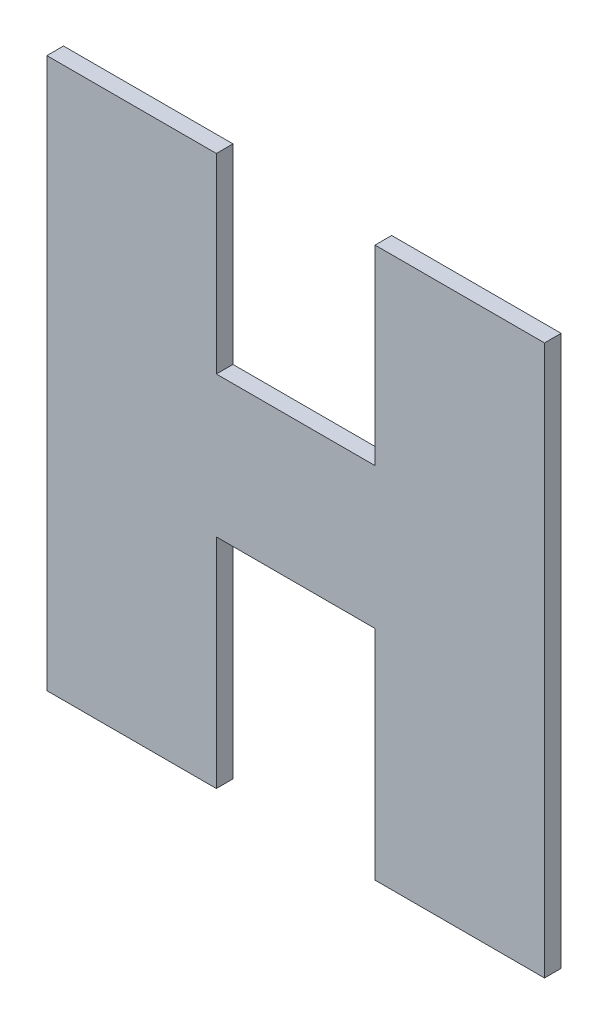
ISO-10303-21;
HEADER;
FILE_DESCRIPTION(('STEP AP214'),'2;1');
FILE_NAME('part.step','',(''),(''),'','','');
FILE_SCHEMA(('AUTOMOTIVE_DESIGN { 1 0 10303 214 1 1 1 1 }'));
ENDSEC;
DATA;
#1=APPLICATION_CONTEXT('core data for automotive mechanical design processes');
#2=APPLICATION_PROTOCOL_DEFINITION('international standard','automotive_design',2000,#1);
#3=PRODUCT_CONTEXT('',#1,'mechanical');
#4=PRODUCT('Part','Part','',(#3));
#5=PRODUCT_RELATED_PRODUCT_CATEGORY('part','',(#4));
#6=PRODUCT_DEFINITION_FORMATION('','',#4);
#7=PRODUCT_DEFINITION_CONTEXT('part definition',#1,'design');
#8=PRODUCT_DEFINITION('design','',#6,#7);
#9=PRODUCT_DEFINITION_SHAPE('','',#8);
#10=(LENGTH_UNIT() NAMED_UNIT(*) SI_UNIT(.MILLI.,.METRE.));
#11=(NAMED_UNIT(*) PLANE_ANGLE_UNIT() SI_UNIT($,.RADIAN.));
#12=(NAMED_UNIT(*) SI_UNIT($,.STERADIAN.) SOLID_ANGLE_UNIT());
#13=UNCERTAINTY_MEASURE_WITH_UNIT(LENGTH_MEASURE(1.E-05),#10,'distance_accuracy_value','');
#14=(GEOMETRIC_REPRESENTATION_CONTEXT(3) GLOBAL_UNCERTAINTY_ASSIGNED_CONTEXT((#13)) GLOBAL_UNIT_ASSIGNED_CONTEXT((#10,
#11,#12)) REPRESENTATION_CONTEXT('',''));
#15=CARTESIAN_POINT('',(0.,0.,0.));
#16=DIRECTION('',(0.,0.,1.));
#17=DIRECTION('',(1.,0.,0.));
#18=AXIS2_PLACEMENT_3D('',#15,#16,#17);
#19=CARTESIAN_POINT('',(0.,0.,0.05));
#20=DIRECTION('',(0.,0.,1.));
#21=DIRECTION('',(1.,0.,0.));
#22=AXIS2_PLACEMENT_3D('',#19,#20,#21);
#23=PLANE('',#22);
#24=DIRECTION('',(1.,0.,0.));
#25=VECTOR('',#24,1.);
#26=CARTESIAN_POINT('',(0.,2.867152,0.05));
#27=LINE('',#26,#25);
#28=CARTESIAN_POINT('',(4.934712,2.867152,0.05));
#29=VERTEX_POINT('',#28);
#30=CARTESIAN_POINT('',(4.457446,2.867152,0.05));
#31=VERTEX_POINT('',#30);
#32=EDGE_CURVE('E122',#29,#31,#27,.F.);
#33=ORIENTED_EDGE('',*,*,#32,.T.);
#34=DIRECTION('',(0.,1.,0.));
#35=VECTOR('',#34,1.);
#36=CARTESIAN_POINT('',(4.457446,2.867152,0.05));
#37=LINE('',#36,#35);
#38=CARTESIAN_POINT('',(4.457446,3.4417,0.05));
#39=VERTEX_POINT('',#38);
#40=EDGE_CURVE('E123',#39,#31,#37,.F.);
#41=ORIENTED_EDGE('',*,*,#40,.F.);
#42=DIRECTION('',(1.,0.,0.));
#43=VECTOR('',#42,1.);
#44=CARTESIAN_POINT('',(4.457446,3.4417,0.05));
#45=LINE('',#44,#43);
#46=CARTESIAN_POINT('',(3.947668,3.4417,0.05));
#47=VERTEX_POINT('',#46);
#48=EDGE_CURVE('E128',#47,#39,#45,.T.);
#49=ORIENTED_EDGE('',*,*,#48,.F.);
#50=DIRECTION('',(0.,1.,0.));
#51=VECTOR('',#50,1.);
#52=CARTESIAN_POINT('',(3.947668,3.4417,0.05));
#53=LINE('',#52,#51);
#54=CARTESIAN_POINT('',(3.947668,1.787398,0.05));
#55=VERTEX_POINT('',#54);
#56=EDGE_CURVE('E132',#55,#47,#53,.T.);
#57=ORIENTED_EDGE('',*,*,#56,.F.);
#58=DIRECTION('',(1.,0.,0.));
#59=VECTOR('',#58,1.);
#60=CARTESIAN_POINT('',(3.947668,1.787398,0.05));
#61=LINE('',#60,#59);
#62=CARTESIAN_POINT('',(4.457446,1.787398,0.05));
#63=VERTEX_POINT('',#62);
#64=EDGE_CURVE('E136',#63,#55,#61,.F.);
#65=ORIENTED_EDGE('',*,*,#64,.F.);
#66=DIRECTION('',(0.,1.,0.));
#67=VECTOR('',#66,1.);
#68=CARTESIAN_POINT('',(4.457446,1.787398,0.05));
#69=LINE('',#68,#67);
#70=CARTESIAN_POINT('',(4.457446,2.442972,0.05));
#71=VERTEX_POINT('',#70);
#72=EDGE_CURVE('E140',#71,#63,#69,.F.);
#73=ORIENTED_EDGE('',*,*,#72,.F.);
#74=DIRECTION('',(1.,0.,0.));
#75=VECTOR('',#74,1.);
#76=CARTESIAN_POINT('',(4.457446,2.442972,0.05));
#77=LINE('',#76,#75);
#78=CARTESIAN_POINT('',(4.934712,2.442972,0.05));
#79=VERTEX_POINT('',#78);
#80=EDGE_CURVE('E144',#79,#71,#77,.F.);
#81=ORIENTED_EDGE('',*,*,#80,.F.);
#82=DIRECTION('',(0.,1.,0.));
#83=VECTOR('',#82,1.);
#84=CARTESIAN_POINT('',(4.934712,2.442972,0.05));
#85=LINE('',#84,#83);
#86=CARTESIAN_POINT('',(4.934712,1.787398,0.05));
#87=VERTEX_POINT('',#86);
#88=EDGE_CURVE('E148',#87,#79,#85,.T.);
#89=ORIENTED_EDGE('',*,*,#88,.F.);
#90=DIRECTION('',(1.,0.,0.));
#91=VECTOR('',#90,1.);
#92=CARTESIAN_POINT('',(4.934712,1.787398,0.05));
#93=LINE('',#92,#91);
#94=CARTESIAN_POINT('',(5.44449,1.787398,0.05));
#95=VERTEX_POINT('',#94);
#96=EDGE_CURVE('E152',#95,#87,#93,.F.);
#97=ORIENTED_EDGE('',*,*,#96,.F.);
#98=DIRECTION('',(0.,1.,0.));
#99=VECTOR('',#98,1.);
#100=CARTESIAN_POINT('',(5.44449,1.787398,0.05));
#101=LINE('',#100,#99);
#102=CARTESIAN_POINT('',(5.44449,3.4417,0.05));
#103=VERTEX_POINT('',#102);
#104=EDGE_CURVE('E107',#103,#95,#101,.F.);
#105=ORIENTED_EDGE('',*,*,#104,.F.);
#106=DIRECTION('',(1.,0.,0.));
#107=VECTOR('',#106,1.);
#108=CARTESIAN_POINT('',(0.,3.4417,0.05));
#109=LINE('',#108,#107);
#110=CARTESIAN_POINT('',(4.934712,3.4417,0.05));
#111=VERTEX_POINT('',#110);
#112=EDGE_CURVE('E20',#103,#111,#109,.F.);
#113=ORIENTED_EDGE('',*,*,#112,.T.);
#114=DIRECTION('',(0.,1.,0.));
#115=VECTOR('',#114,1.);
#116=CARTESIAN_POINT('',(4.934712,0.,0.05));
#117=LINE('',#116,#115);
#118=EDGE_CURVE('E103',#111,#29,#117,.F.);
#119=ORIENTED_EDGE('',*,*,#118,.T.);
#120=EDGE_LOOP('',(#33,#41,#49,#57,#65,#73,#81,#89,#97,#105,#113,#119));
#121=FACE_BOUND('',#120,.T.);
#122=ADVANCED_FACE('F17',(#121),#23,.T.);
#123=CARTESIAN_POINT('',(4.457446,2.867152,0.));
#124=DIRECTION('',(1.,0.,0.));
#125=DIRECTION('',(0.,0.,-1.));
#126=AXIS2_PLACEMENT_3D('',#123,#124,#125);
#127=PLANE('',#126);
#128=DIRECTION('',(0.,0.,1.));
#129=VECTOR('',#128,1.);
#130=CARTESIAN_POINT('',(4.457446,2.867152,0.));
#131=LINE('',#130,#129);
#132=CARTESIAN_POINT('',(4.457446,2.867152,0.));
#133=VERTEX_POINT('',#132);
#134=EDGE_CURVE('E118',#133,#31,#131,.T.);
#135=ORIENTED_EDGE('',*,*,#134,.F.);
#136=DIRECTION('',(0.,1.,0.));
#137=VECTOR('',#136,1.);
#138=CARTESIAN_POINT('',(4.457446,0.,0.));
#139=LINE('',#138,#137);
#140=CARTESIAN_POINT('',(4.457446,3.4417,0.));
#141=VERTEX_POINT('',#140);
#142=EDGE_CURVE('E163',#133,#141,#139,.T.);
#143=ORIENTED_EDGE('',*,*,#142,.T.);
#144=DIRECTION('',(0.,0.,1.));
#145=VECTOR('',#144,1.);
#146=CARTESIAN_POINT('',(4.457446,3.4417,0.));
#147=LINE('',#146,#145);
#148=EDGE_CURVE('E130',#39,#141,#147,.F.);
#149=ORIENTED_EDGE('',*,*,#148,.F.);
#150=ORIENTED_EDGE('',*,*,#40,.T.);
#151=EDGE_LOOP('',(#135,#143,#149,#150));
#152=FACE_BOUND('',#151,.T.);
#153=ADVANCED_FACE('F198',(#152),#127,.T.);
#154=CARTESIAN_POINT('',(4.457446,3.4417,0.));
#155=DIRECTION('',(0.,1.,0.));
#156=DIRECTION('',(0.,0.,1.));
#157=AXIS2_PLACEMENT_3D('',#154,#155,#156);
#158=PLANE('',#157);
#159=ORIENTED_EDGE('',*,*,#148,.T.);
#160=DIRECTION('',(1.,0.,0.));
#161=VECTOR('',#160,1.);
#162=CARTESIAN_POINT('',(0.,3.4417,0.));
#163=LINE('',#162,#161);
#164=CARTESIAN_POINT('',(3.947668,3.4417,0.));
#165=VERTEX_POINT('',#164);
#166=EDGE_CURVE('E166',#141,#165,#163,.F.);
#167=ORIENTED_EDGE('',*,*,#166,.T.);
#168=DIRECTION('',(0.,0.,1.));
#169=VECTOR('',#168,1.);
#170=CARTESIAN_POINT('',(3.947668,3.4417,0.));
#171=LINE('',#170,#169);
#172=EDGE_CURVE('E134',#47,#165,#171,.F.);
#173=ORIENTED_EDGE('',*,*,#172,.F.);
#174=ORIENTED_EDGE('',*,*,#48,.T.);
#175=EDGE_LOOP('',(#159,#167,#173,#174));
#176=FACE_BOUND('',#175,.T.);
#177=ADVANCED_FACE('F207',(#176),#158,.T.);
#178=CARTESIAN_POINT('',(3.947668,3.4417,0.));
#179=DIRECTION('',(-1.,0.,0.));
#180=DIRECTION('',(0.,0.,1.));
#181=AXIS2_PLACEMENT_3D('',#178,#179,#180);
#182=PLANE('',#181);
#183=ORIENTED_EDGE('',*,*,#172,.T.);
#184=DIRECTION('',(0.,1.,0.));
#185=VECTOR('',#184,1.);
#186=CARTESIAN_POINT('',(3.947668,0.,0.));
#187=LINE('',#186,#185);
#188=CARTESIAN_POINT('',(3.947668,1.787398,0.));
#189=VERTEX_POINT('',#188);
#190=EDGE_CURVE('E169',#165,#189,#187,.F.);
#191=ORIENTED_EDGE('',*,*,#190,.T.);
#192=DIRECTION('',(0.,0.,-1.));
#193=VECTOR('',#192,1.);
#194=CARTESIAN_POINT('',(3.947668,1.787398,0.));
#195=LINE('',#194,#193);
#196=EDGE_CURVE('E138',#55,#189,#195,.T.);
#197=ORIENTED_EDGE('',*,*,#196,.F.);
#198=ORIENTED_EDGE('',*,*,#56,.T.);
#199=EDGE_LOOP('',(#183,#191,#197,#198));
#200=FACE_BOUND('',#199,.T.);
#201=ADVANCED_FACE('F210',(#200),#182,.T.);
#202=CARTESIAN_POINT('',(3.947668,1.787398,0.));
#203=DIRECTION('',(0.,-1.,0.));
#204=DIRECTION('',(0.,0.,-1.));
#205=AXIS2_PLACEMENT_3D('',#202,#203,#204);
#206=PLANE('',#205);
#207=ORIENTED_EDGE('',*,*,#196,.T.);
#208=DIRECTION('',(1.,0.,0.));
#209=VECTOR('',#208,1.);
#210=CARTESIAN_POINT('',(0.,1.787398,0.));
#211=LINE('',#210,#209);
#212=CARTESIAN_POINT('',(4.457446,1.787398,0.));
#213=VERTEX_POINT('',#212);
#214=EDGE_CURVE('E172',#189,#213,#211,.T.);
#215=ORIENTED_EDGE('',*,*,#214,.T.);
#216=DIRECTION('',(0.,0.,-1.));
#217=VECTOR('',#216,1.);
#218=CARTESIAN_POINT('',(4.457446,1.787398,0.));
#219=LINE('',#218,#217);
#220=EDGE_CURVE('E142',#63,#213,#219,.T.);
#221=ORIENTED_EDGE('',*,*,#220,.F.);
#222=ORIENTED_EDGE('',*,*,#64,.T.);
#223=EDGE_LOOP('',(#207,#215,#221,#222));
#224=FACE_BOUND('',#223,.T.);
#225=ADVANCED_FACE('F216',(#224),#206,.T.);
#226=CARTESIAN_POINT('',(4.457446,1.787398,0.));
#227=DIRECTION('',(1.,0.,0.));
#228=DIRECTION('',(0.,0.,-1.));
#229=AXIS2_PLACEMENT_3D('',#226,#227,#228);
#230=PLANE('',#229);
#231=ORIENTED_EDGE('',*,*,#220,.T.);
#232=DIRECTION('',(0.,1.,0.));
#233=VECTOR('',#232,1.);
#234=CARTESIAN_POINT('',(4.457446,0.,0.));
#235=LINE('',#234,#233);
#236=CARTESIAN_POINT('',(4.457446,2.442972,0.));
#237=VERTEX_POINT('',#236);
#238=EDGE_CURVE('E175',#213,#237,#235,.T.);
#239=ORIENTED_EDGE('',*,*,#238,.T.);
#240=DIRECTION('',(0.,0.,-1.));
#241=VECTOR('',#240,1.);
#242=CARTESIAN_POINT('',(4.457446,2.442972,0.));
#243=LINE('',#242,#241);
#244=EDGE_CURVE('E146',#71,#237,#243,.T.);
#245=ORIENTED_EDGE('',*,*,#244,.F.);
#246=ORIENTED_EDGE('',*,*,#72,.T.);
#247=EDGE_LOOP('',(#231,#239,#245,#246));
#248=FACE_BOUND('',#247,.T.);
#249=ADVANCED_FACE('F223',(#248),#230,.T.);
#250=CARTESIAN_POINT('',(4.457446,2.442972,0.));
#251=DIRECTION('',(0.,-1.,0.));
#252=DIRECTION('',(0.,0.,-1.));
#253=AXIS2_PLACEMENT_3D('',#250,#251,#252);
#254=PLANE('',#253);
#255=ORIENTED_EDGE('',*,*,#244,.T.);
#256=DIRECTION('',(1.,0.,0.));
#257=VECTOR('',#256,1.);
#258=CARTESIAN_POINT('',(0.,2.442972,0.));
#259=LINE('',#258,#257);
#260=CARTESIAN_POINT('',(4.934712,2.442972,0.));
#261=VERTEX_POINT('',#260);
#262=EDGE_CURVE('E178',#237,#261,#259,.T.);
#263=ORIENTED_EDGE('',*,*,#262,.T.);
#264=DIRECTION('',(0.,0.,1.));
#265=VECTOR('',#264,1.);
#266=CARTESIAN_POINT('',(4.934712,2.442972,0.));
#267=LINE('',#266,#265);
#268=EDGE_CURVE('E150',#79,#261,#267,.F.);
#269=ORIENTED_EDGE('',*,*,#268,.F.);
#270=ORIENTED_EDGE('',*,*,#80,.T.);
#271=EDGE_LOOP('',(#255,#263,#269,#270));
#272=FACE_BOUND('',#271,.T.);
#273=ADVANCED_FACE('F225',(#272),#254,.T.);
#274=CARTESIAN_POINT('',(4.934712,2.442972,0.));
#275=DIRECTION('',(-1.,0.,0.));
#276=DIRECTION('',(0.,0.,1.));
#277=AXIS2_PLACEMENT_3D('',#274,#275,#276);
#278=PLANE('',#277);
#279=ORIENTED_EDGE('',*,*,#268,.T.);
#280=DIRECTION('',(0.,1.,0.));
#281=VECTOR('',#280,1.);
#282=CARTESIAN_POINT('',(4.934712,0.,0.));
#283=LINE('',#282,#281);
#284=CARTESIAN_POINT('',(4.934712,1.787398,0.));
#285=VERTEX_POINT('',#284);
#286=EDGE_CURVE('E181',#261,#285,#283,.F.);
#287=ORIENTED_EDGE('',*,*,#286,.T.);
#288=DIRECTION('',(0.,0.,-1.));
#289=VECTOR('',#288,1.);
#290=CARTESIAN_POINT('',(4.934712,1.787398,0.));
#291=LINE('',#290,#289);
#292=EDGE_CURVE('E154',#87,#285,#291,.T.);
#293=ORIENTED_EDGE('',*,*,#292,.F.);
#294=ORIENTED_EDGE('',*,*,#88,.T.);
#295=EDGE_LOOP('',(#279,#287,#293,#294));
#296=FACE_BOUND('',#295,.T.);
#297=ADVANCED_FACE('F230',(#296),#278,.T.);
#298=CARTESIAN_POINT('',(4.934712,1.787398,0.));
#299=DIRECTION('',(0.,-1.,0.));
#300=DIRECTION('',(0.,0.,-1.));
#301=AXIS2_PLACEMENT_3D('',#298,#299,#300);
#302=PLANE('',#301);
#303=ORIENTED_EDGE('',*,*,#292,.T.);
#304=DIRECTION('',(1.,0.,0.));
#305=VECTOR('',#304,1.);
#306=CARTESIAN_POINT('',(0.,1.787398,0.));
#307=LINE('',#306,#305);
#308=CARTESIAN_POINT('',(5.44449,1.787398,0.));
#309=VERTEX_POINT('',#308);
#310=EDGE_CURVE('E184',#285,#309,#307,.T.);
#311=ORIENTED_EDGE('',*,*,#310,.T.);
#312=DIRECTION('',(0.,0.,-1.));
#313=VECTOR('',#312,1.);
#314=CARTESIAN_POINT('',(5.44449,1.787398,0.));
#315=LINE('',#314,#313);
#316=EDGE_CURVE('E157',#95,#309,#315,.T.);
#317=ORIENTED_EDGE('',*,*,#316,.F.);
#318=ORIENTED_EDGE('',*,*,#96,.T.);
#319=EDGE_LOOP('',(#303,#311,#317,#318));
#320=FACE_BOUND('',#319,.T.);
#321=ADVANCED_FACE('F233',(#320),#302,.T.);
#322=CARTESIAN_POINT('',(5.44449,1.787398,0.));
#323=DIRECTION('',(1.,0.,0.));
#324=DIRECTION('',(0.,0.,-1.));
#325=AXIS2_PLACEMENT_3D('',#322,#323,#324);
#326=PLANE('',#325);
#327=ORIENTED_EDGE('',*,*,#316,.T.);
#328=DIRECTION('',(0.,1.,0.));
#329=VECTOR('',#328,1.);
#330=CARTESIAN_POINT('',(5.44449,0.,0.));
#331=LINE('',#330,#329);
#332=CARTESIAN_POINT('',(5.44449,3.4417,0.));
#333=VERTEX_POINT('',#332);
#334=EDGE_CURVE('E187',#309,#333,#331,.T.);
#335=ORIENTED_EDGE('',*,*,#334,.T.);
#336=DIRECTION('',(0.,0.,1.));
#337=VECTOR('',#336,1.);
#338=CARTESIAN_POINT('',(5.44449,3.4417,0.));
#339=LINE('',#338,#337);
#340=EDGE_CURVE('E119',#103,#333,#339,.F.);
#341=ORIENTED_EDGE('',*,*,#340,.F.);
#342=ORIENTED_EDGE('',*,*,#104,.T.);
#343=EDGE_LOOP('',(#327,#335,#341,#342));
#344=FACE_BOUND('',#343,.T.);
#345=ADVANCED_FACE('F235',(#344),#326,.T.);
#346=CARTESIAN_POINT('',(5.44449,3.4417,0.));
#347=DIRECTION('',(0.,1.,0.));
#348=DIRECTION('',(0.,0.,1.));
#349=AXIS2_PLACEMENT_3D('',#346,#347,#348);
#350=PLANE('',#349);
#351=ORIENTED_EDGE('',*,*,#340,.T.);
#352=DIRECTION('',(1.,0.,0.));
#353=VECTOR('',#352,1.);
#354=CARTESIAN_POINT('',(0.,3.4417,0.));
#355=LINE('',#354,#353);
#356=CARTESIAN_POINT('',(4.934712,3.4417,0.));
#357=VERTEX_POINT('',#356);
#358=EDGE_CURVE('E114',#333,#357,#355,.F.);
#359=ORIENTED_EDGE('',*,*,#358,.T.);
#360=DIRECTION('',(0.,0.,1.));
#361=VECTOR('',#360,1.);
#362=CARTESIAN_POINT('',(4.934712,3.4417,0.));
#363=LINE('',#362,#361);
#364=EDGE_CURVE('E111',#111,#357,#363,.F.);
#365=ORIENTED_EDGE('',*,*,#364,.F.);
#366=ORIENTED_EDGE('',*,*,#112,.F.);
#367=EDGE_LOOP('',(#351,#359,#365,#366));
#368=FACE_BOUND('',#367,.T.);
#369=ADVANCED_FACE('F112',(#368),#350,.T.);
#370=CARTESIAN_POINT('',(4.934712,3.4417,0.));
#371=DIRECTION('',(-1.,0.,0.));
#372=DIRECTION('',(0.,0.,1.));
#373=AXIS2_PLACEMENT_3D('',#370,#371,#372);
#374=PLANE('',#373);
#375=ORIENTED_EDGE('',*,*,#364,.T.);
#376=DIRECTION('',(0.,1.,0.));
#377=VECTOR('',#376,1.);
#378=CARTESIAN_POINT('',(4.934712,0.,0.));
#379=LINE('',#378,#377);
#380=CARTESIAN_POINT('',(4.934712,2.867152,0.));
#381=VERTEX_POINT('',#380);
#382=EDGE_CURVE('E26',#357,#381,#379,.F.);
#383=ORIENTED_EDGE('',*,*,#382,.T.);
#384=DIRECTION('',(0.,0.,1.));
#385=VECTOR('',#384,1.);
#386=CARTESIAN_POINT('',(4.934712,2.867152,0.));
#387=LINE('',#386,#385);
#388=EDGE_CURVE('E34',#29,#381,#387,.F.);
#389=ORIENTED_EDGE('',*,*,#388,.F.);
#390=ORIENTED_EDGE('',*,*,#118,.F.);
#391=EDGE_LOOP('',(#375,#383,#389,#390));
#392=FACE_BOUND('',#391,.T.);
#393=ADVANCED_FACE('F121',(#392),#374,.T.);
#394=CARTESIAN_POINT('',(4.934712,2.867152,0.));
#395=DIRECTION('',(0.,1.,0.));
#396=DIRECTION('',(0.,0.,1.));
#397=AXIS2_PLACEMENT_3D('',#394,#395,#396);
#398=PLANE('',#397);
#399=ORIENTED_EDGE('',*,*,#388,.T.);
#400=DIRECTION('',(1.,0.,0.));
#401=VECTOR('',#400,1.);
#402=CARTESIAN_POINT('',(0.,2.867152,0.));
#403=LINE('',#402,#401);
#404=EDGE_CURVE('E11',#381,#133,#403,.F.);
#405=ORIENTED_EDGE('',*,*,#404,.T.);
#406=ORIENTED_EDGE('',*,*,#134,.T.);
#407=ORIENTED_EDGE('',*,*,#32,.F.);
#408=EDGE_LOOP('',(#399,#405,#406,#407));
#409=FACE_BOUND('',#408,.T.);
#410=ADVANCED_FACE('F196',(#409),#398,.T.);
#411=CARTESIAN_POINT('',(0.,0.,0.));
#412=DIRECTION('',(0.,0.,1.));
#413=DIRECTION('',(1.,0.,0.));
#414=AXIS2_PLACEMENT_3D('',#411,#412,#413);
#415=PLANE('',#414);
#416=ORIENTED_EDGE('',*,*,#382,.F.);
#417=ORIENTED_EDGE('',*,*,#358,.F.);
#418=ORIENTED_EDGE('',*,*,#334,.F.);
#419=ORIENTED_EDGE('',*,*,#310,.F.);
#420=ORIENTED_EDGE('',*,*,#286,.F.);
#421=ORIENTED_EDGE('',*,*,#262,.F.);
#422=ORIENTED_EDGE('',*,*,#238,.F.);
#423=ORIENTED_EDGE('',*,*,#214,.F.);
#424=ORIENTED_EDGE('',*,*,#190,.F.);
#425=ORIENTED_EDGE('',*,*,#166,.F.);
#426=ORIENTED_EDGE('',*,*,#142,.F.);
#427=ORIENTED_EDGE('',*,*,#404,.F.);
#428=EDGE_LOOP('',(#416,#417,#418,#419,#420,#421,#422,#423,#424,#425,#426,#427));
#429=FACE_BOUND('',#428,.T.);
#430=ADVANCED_FACE('F192',(#429),#415,.F.);
#431=CLOSED_SHELL('',(#122,#153,#177,#201,#225,#249,#273,#297,#321,#345,#369,#393,#410,#430));
#432=MANIFOLD_SOLID_BREP('B1',#431);
#433=ADVANCED_BREP_SHAPE_REPRESENTATION('',(#18,#432),#14);
#434=SHAPE_DEFINITION_REPRESENTATION(#9,#433);
ENDSEC;
END-ISO-10303-21;
